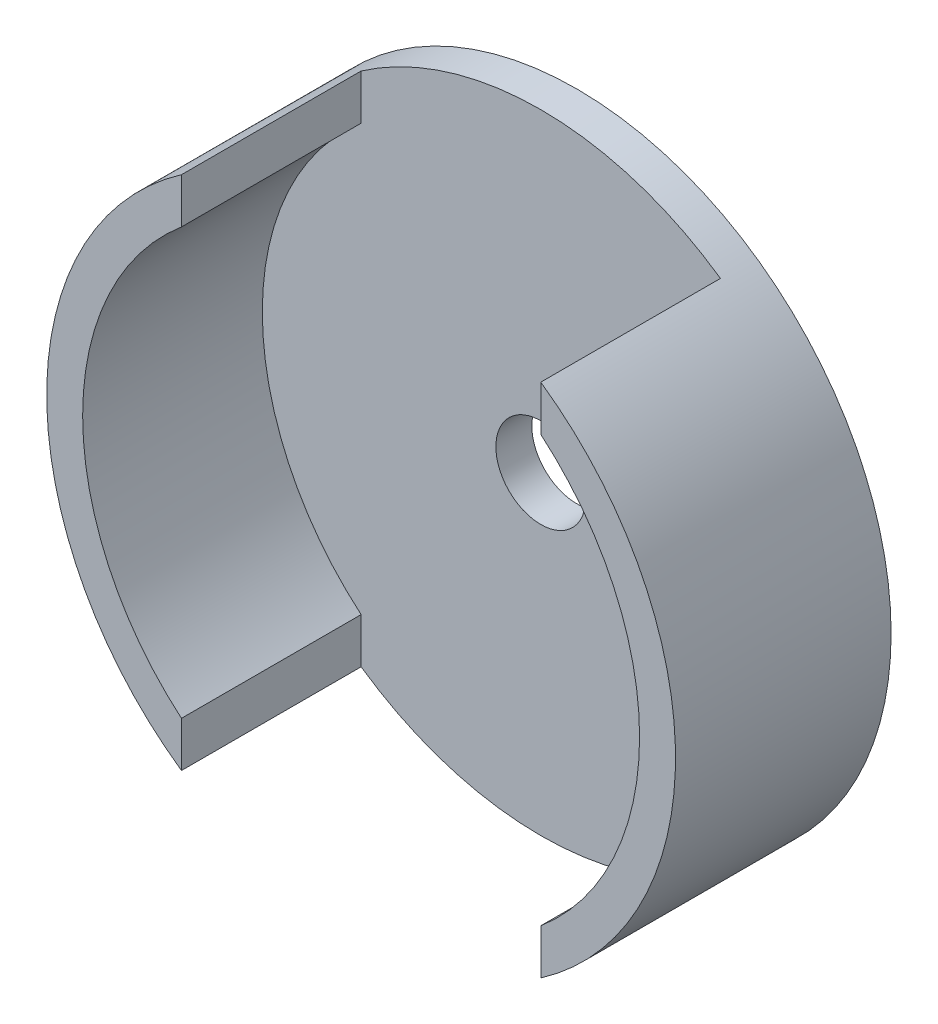
ISO-10303-21;
HEADER;
FILE_DESCRIPTION(('STEP AP214'),'2;1');
FILE_NAME('part.step','',(''),(''),'','','');
FILE_SCHEMA(('AUTOMOTIVE_DESIGN { 1 0 10303 214 1 1 1 1 }'));
ENDSEC;
DATA;
#1=APPLICATION_CONTEXT('core data for automotive mechanical design processes');
#2=APPLICATION_PROTOCOL_DEFINITION('international standard','automotive_design',2000,#1);
#3=PRODUCT_CONTEXT('',#1,'mechanical');
#4=PRODUCT('Part','Part','',(#3));
#5=PRODUCT_RELATED_PRODUCT_CATEGORY('part','',(#4));
#6=PRODUCT_DEFINITION_FORMATION('','',#4);
#7=PRODUCT_DEFINITION_CONTEXT('part definition',#1,'design');
#8=PRODUCT_DEFINITION('design','',#6,#7);
#9=PRODUCT_DEFINITION_SHAPE('','',#8);
#10=(LENGTH_UNIT() NAMED_UNIT(*) SI_UNIT(.MILLI.,.METRE.));
#11=(NAMED_UNIT(*) PLANE_ANGLE_UNIT() SI_UNIT($,.RADIAN.));
#12=(NAMED_UNIT(*) SI_UNIT($,.STERADIAN.) SOLID_ANGLE_UNIT());
#13=UNCERTAINTY_MEASURE_WITH_UNIT(LENGTH_MEASURE(1.E-05),#10,'distance_accuracy_value','');
#14=(GEOMETRIC_REPRESENTATION_CONTEXT(3) GLOBAL_UNCERTAINTY_ASSIGNED_CONTEXT((#13)) GLOBAL_UNIT_ASSIGNED_CONTEXT((#10,
#11,#12)) REPRESENTATION_CONTEXT('',''));
#15=CARTESIAN_POINT('',(0.,0.,0.));
#16=DIRECTION('',(0.,0.,1.));
#17=DIRECTION('',(1.,0.,0.));
#18=AXIS2_PLACEMENT_3D('',#15,#16,#17);
#19=CARTESIAN_POINT('',(0.,0.,12.));
#20=DIRECTION('',(0.,0.,1.));
#21=DIRECTION('',(1.,0.,0.));
#22=AXIS2_PLACEMENT_3D('',#19,#20,#21);
#23=PLANE('',#22);
#24=DIRECTION('',(0.,-1.,0.));
#25=VECTOR('',#24,1.);
#26=CARTESIAN_POINT('',(-10.,0.,12.));
#27=LINE('',#26,#25);
#28=CARTESIAN_POINT('',(-10.,14.3614066163451,12.));
#29=VERTEX_POINT('',#28);
#30=CARTESIAN_POINT('',(-10.,11.842719282327,12.));
#31=VERTEX_POINT('',#30);
#32=EDGE_CURVE('E159',#29,#31,#27,.T.);
#33=ORIENTED_EDGE('',*,*,#32,.F.);
#34=CARTESIAN_POINT('',(0.,0.,12.));
#35=DIRECTION('',(0.,0.,1.));
#36=DIRECTION('',(1.,0.,0.));
#37=AXIS2_PLACEMENT_3D('',#34,#35,#36);
#38=CIRCLE('',#37,17.5);
#39=CARTESIAN_POINT('',(-10.,-14.3614066163451,12.));
#40=VERTEX_POINT('',#39);
#41=EDGE_CURVE('E11',#29,#40,#38,.T.);
#42=ORIENTED_EDGE('',*,*,#41,.T.);
#43=CARTESIAN_POINT('',(-10.,-11.842719282327,12.));
#44=VERTEX_POINT('',#43);
#45=EDGE_CURVE('E131',#44,#40,#27,.T.);
#46=ORIENTED_EDGE('',*,*,#45,.F.);
#47=CARTESIAN_POINT('',(0.,0.,12.));
#48=DIRECTION('',(0.,0.,1.));
#49=DIRECTION('',(1.,0.,0.));
#50=AXIS2_PLACEMENT_3D('',#47,#48,#49);
#51=CIRCLE('',#50,15.5);
#52=EDGE_CURVE('E172',#31,#44,#51,.T.);
#53=ORIENTED_EDGE('',*,*,#52,.F.);
#54=EDGE_LOOP('',(#33,#42,#46,#53));
#55=FACE_BOUND('',#54,.T.);
#56=ADVANCED_FACE('F45',(#55),#23,.T.);
#57=CARTESIAN_POINT('',(0.,0.,12.));
#58=DIRECTION('',(0.,0.,-1.));
#59=DIRECTION('',(-1.,0.,0.));
#60=AXIS2_PLACEMENT_3D('',#57,#58,#59);
#61=CYLINDRICAL_SURFACE('',#60,15.5);
#62=DIRECTION('',(0.,0.,-1.));
#63=VECTOR('',#62,1.);
#64=CARTESIAN_POINT('',(-10.,11.842719282327,12.));
#65=LINE('',#64,#63);
#66=CARTESIAN_POINT('',(-10.,11.842719282327,2.));
#67=VERTEX_POINT('',#66);
#68=EDGE_CURVE('E132',#31,#67,#65,.T.);
#69=ORIENTED_EDGE('',*,*,#68,.F.);
#70=ORIENTED_EDGE('',*,*,#52,.T.);
#71=DIRECTION('',(0.,0.,-1.));
#72=VECTOR('',#71,1.);
#73=CARTESIAN_POINT('',(-10.,-11.842719282327,12.));
#74=LINE('',#73,#72);
#75=CARTESIAN_POINT('',(-10.,-11.842719282327,2.));
#76=VERTEX_POINT('',#75);
#77=EDGE_CURVE('E157',#76,#44,#74,.F.);
#78=ORIENTED_EDGE('',*,*,#77,.F.);
#79=CARTESIAN_POINT('',(0.,0.,2.));
#80=DIRECTION('',(0.,0.,1.));
#81=DIRECTION('',(1.,0.,0.));
#82=AXIS2_PLACEMENT_3D('',#79,#80,#81);
#83=CIRCLE('',#82,15.5);
#84=EDGE_CURVE('E140',#67,#76,#83,.T.);
#85=ORIENTED_EDGE('',*,*,#84,.F.);
#86=EDGE_LOOP('',(#69,#70,#78,#85));
#87=FACE_BOUND('',#86,.T.);
#88=ADVANCED_FACE('F181',(#87),#61,.F.);
#89=CARTESIAN_POINT('',(0.,0.,12.));
#90=DIRECTION('',(0.,0.,-1.));
#91=DIRECTION('',(-1.,0.,0.));
#92=AXIS2_PLACEMENT_3D('',#89,#90,#91);
#93=CYLINDRICAL_SURFACE('',#92,17.5);
#94=ORIENTED_EDGE('',*,*,#41,.F.);
#95=DIRECTION('',(0.,0.,-1.));
#96=VECTOR('',#95,1.);
#97=CARTESIAN_POINT('',(-10.,14.3614066163451,12.));
#98=LINE('',#97,#96);
#99=CARTESIAN_POINT('',(-10.,14.3614066163451,2.));
#100=VERTEX_POINT('',#99);
#101=EDGE_CURVE('E162',#29,#100,#98,.T.);
#102=ORIENTED_EDGE('',*,*,#101,.T.);
#103=CARTESIAN_POINT('',(0.,0.,2.));
#104=DIRECTION('',(0.,0.,-1.));
#105=DIRECTION('',(-1.,0.,0.));
#106=AXIS2_PLACEMENT_3D('',#103,#104,#105);
#107=CIRCLE('',#106,17.5);
#108=CARTESIAN_POINT('',(10.,14.3614066163451,2.));
#109=VERTEX_POINT('',#108);
#110=EDGE_CURVE('E124',#100,#109,#107,.T.);
#111=ORIENTED_EDGE('',*,*,#110,.T.);
#112=DIRECTION('',(0.,0.,-1.));
#113=VECTOR('',#112,1.);
#114=CARTESIAN_POINT('',(10.,14.3614066163451,12.));
#115=LINE('',#114,#113);
#116=CARTESIAN_POINT('',(10.,14.3614066163451,12.));
#117=VERTEX_POINT('',#116);
#118=EDGE_CURVE('E151',#109,#117,#115,.F.);
#119=ORIENTED_EDGE('',*,*,#118,.T.);
#120=CARTESIAN_POINT('',(10.,-14.3614066163451,12.));
#121=VERTEX_POINT('',#120);
#122=EDGE_CURVE('E54',#121,#117,#38,.T.);
#123=ORIENTED_EDGE('',*,*,#122,.F.);
#124=DIRECTION('',(0.,0.,-1.));
#125=VECTOR('',#124,1.);
#126=CARTESIAN_POINT('',(10.,-14.3614066163451,12.));
#127=LINE('',#126,#125);
#128=CARTESIAN_POINT('',(10.,-14.3614066163451,2.));
#129=VERTEX_POINT('',#128);
#130=EDGE_CURVE('E119',#121,#129,#127,.T.);
#131=ORIENTED_EDGE('',*,*,#130,.T.);
#132=CARTESIAN_POINT('',(-10.,-14.3614066163451,2.));
#133=VERTEX_POINT('',#132);
#134=EDGE_CURVE('E113',#129,#133,#107,.T.);
#135=ORIENTED_EDGE('',*,*,#134,.T.);
#136=DIRECTION('',(0.,0.,-1.));
#137=VECTOR('',#136,1.);
#138=CARTESIAN_POINT('',(-10.,-14.3614066163451,12.));
#139=LINE('',#138,#137);
#140=EDGE_CURVE('E117',#133,#40,#139,.F.);
#141=ORIENTED_EDGE('',*,*,#140,.T.);
#142=EDGE_LOOP('',(#94,#102,#111,#119,#123,#131,#135,#141));
#143=FACE_BOUND('',#142,.T.);
#144=CARTESIAN_POINT('',(0.,0.,0.));
#145=DIRECTION('',(0.,0.,1.));
#146=DIRECTION('',(1.,0.,0.));
#147=AXIS2_PLACEMENT_3D('',#144,#145,#146);
#148=CIRCLE('',#147,17.5);
#149=CARTESIAN_POINT('',(17.5,0.,0.));
#150=VERTEX_POINT('',#149);
#151=EDGE_CURVE('E174',#150,#150,#148,.T.);
#152=ORIENTED_EDGE('',*,*,#151,.T.);
#153=EDGE_LOOP('',(#152));
#154=FACE_BOUND('',#153,.T.);
#155=ADVANCED_FACE('F47',(#143,#154),#93,.T.);
#156=DIRECTION('',(0.,1.,0.));
#157=VECTOR('',#156,1.);
#158=CARTESIAN_POINT('',(10.,0.,12.));
#159=LINE('',#158,#157);
#160=CARTESIAN_POINT('',(10.,-11.842719282327,12.));
#161=VERTEX_POINT('',#160);
#162=EDGE_CURVE('E62',#121,#161,#159,.T.);
#163=ORIENTED_EDGE('',*,*,#162,.F.);
#164=ORIENTED_EDGE('',*,*,#122,.T.);
#165=CARTESIAN_POINT('',(10.,11.842719282327,12.));
#166=VERTEX_POINT('',#165);
#167=EDGE_CURVE('E149',#166,#117,#159,.T.);
#168=ORIENTED_EDGE('',*,*,#167,.F.);
#169=EDGE_CURVE('E170',#161,#166,#51,.T.);
#170=ORIENTED_EDGE('',*,*,#169,.F.);
#171=EDGE_LOOP('',(#163,#164,#168,#170));
#172=FACE_BOUND('',#171,.T.);
#173=ADVANCED_FACE('F193',(#172),#23,.T.);
#174=CARTESIAN_POINT('',(0.,0.,0.));
#175=DIRECTION('',(0.,0.,1.));
#176=DIRECTION('',(1.,0.,0.));
#177=AXIS2_PLACEMENT_3D('',#174,#175,#176);
#178=PLANE('',#177);
#179=CARTESIAN_POINT('',(0.,0.,0.));
#180=DIRECTION('',(0.,0.,1.));
#181=DIRECTION('',(1.,0.,0.));
#182=AXIS2_PLACEMENT_3D('',#179,#180,#181);
#183=CIRCLE('',#182,2.5);
#184=CARTESIAN_POINT('',(2.5,0.,0.));
#185=VERTEX_POINT('',#184);
#186=EDGE_CURVE('E165',#185,#185,#183,.F.);
#187=ORIENTED_EDGE('',*,*,#186,.F.);
#188=EDGE_LOOP('',(#187));
#189=FACE_BOUND('',#188,.T.);
#190=ORIENTED_EDGE('',*,*,#151,.F.);
#191=EDGE_LOOP('',(#190));
#192=FACE_BOUND('',#191,.T.);
#193=ADVANCED_FACE('F195',(#189,#192),#178,.F.);
#194=DIRECTION('',(0.,0.,-1.));
#195=VECTOR('',#194,1.);
#196=CARTESIAN_POINT('',(10.,-11.842719282327,12.));
#197=LINE('',#196,#195);
#198=CARTESIAN_POINT('',(10.,-11.842719282327,2.));
#199=VERTEX_POINT('',#198);
#200=EDGE_CURVE('E154',#161,#199,#197,.T.);
#201=ORIENTED_EDGE('',*,*,#200,.F.);
#202=ORIENTED_EDGE('',*,*,#169,.T.);
#203=DIRECTION('',(0.,0.,-1.));
#204=VECTOR('',#203,1.);
#205=CARTESIAN_POINT('',(10.,11.842719282327,12.));
#206=LINE('',#205,#204);
#207=CARTESIAN_POINT('',(10.,11.842719282327,2.));
#208=VERTEX_POINT('',#207);
#209=EDGE_CURVE('E147',#208,#166,#206,.F.);
#210=ORIENTED_EDGE('',*,*,#209,.F.);
#211=EDGE_CURVE('E168',#199,#208,#83,.T.);
#212=ORIENTED_EDGE('',*,*,#211,.F.);
#213=EDGE_LOOP('',(#201,#202,#210,#212));
#214=FACE_BOUND('',#213,.T.);
#215=ADVANCED_FACE('F188',(#214),#61,.F.);
#216=CARTESIAN_POINT('',(0.,0.,2.));
#217=DIRECTION('',(0.,0.,1.));
#218=DIRECTION('',(1.,0.,0.));
#219=AXIS2_PLACEMENT_3D('',#216,#217,#218);
#220=PLANE('',#219);
#221=ORIENTED_EDGE('',*,*,#211,.T.);
#222=DIRECTION('',(0.,1.,0.));
#223=VECTOR('',#222,1.);
#224=CARTESIAN_POINT('',(10.,-17.5,2.));
#225=LINE('',#224,#223);
#226=EDGE_CURVE('E70',#208,#109,#225,.T.);
#227=ORIENTED_EDGE('',*,*,#226,.T.);
#228=ORIENTED_EDGE('',*,*,#110,.F.);
#229=DIRECTION('',(0.,1.,0.));
#230=VECTOR('',#229,1.);
#231=CARTESIAN_POINT('',(-10.,-17.5,2.));
#232=LINE('',#231,#230);
#233=EDGE_CURVE('E141',#67,#100,#232,.T.);
#234=ORIENTED_EDGE('',*,*,#233,.F.);
#235=ORIENTED_EDGE('',*,*,#84,.T.);
#236=EDGE_CURVE('E125',#133,#76,#232,.T.);
#237=ORIENTED_EDGE('',*,*,#236,.F.);
#238=ORIENTED_EDGE('',*,*,#134,.F.);
#239=EDGE_CURVE('E144',#129,#199,#225,.T.);
#240=ORIENTED_EDGE('',*,*,#239,.T.);
#241=EDGE_LOOP('',(#221,#227,#228,#234,#235,#237,#238,#240));
#242=FACE_BOUND('',#241,.T.);
#243=CARTESIAN_POINT('',(0.,0.,2.));
#244=DIRECTION('',(0.,0.,1.));
#245=DIRECTION('',(1.,0.,0.));
#246=AXIS2_PLACEMENT_3D('',#243,#244,#245);
#247=CIRCLE('',#246,2.5);
#248=CARTESIAN_POINT('',(2.5,0.,2.));
#249=VERTEX_POINT('',#248);
#250=EDGE_CURVE('E49',#249,#249,#247,.F.);
#251=ORIENTED_EDGE('',*,*,#250,.T.);
#252=EDGE_LOOP('',(#251));
#253=FACE_BOUND('',#252,.T.);
#254=ADVANCED_FACE('F136',(#242,#253),#220,.T.);
#255=CARTESIAN_POINT('',(0.,0.,12.));
#256=DIRECTION('',(0.,0.,-1.));
#257=DIRECTION('',(-1.,0.,0.));
#258=AXIS2_PLACEMENT_3D('',#255,#256,#257);
#259=CYLINDRICAL_SURFACE('',#258,2.5);
#260=ORIENTED_EDGE('',*,*,#250,.F.);
#261=EDGE_LOOP('',(#260));
#262=FACE_BOUND('',#261,.T.);
#263=ORIENTED_EDGE('',*,*,#186,.T.);
#264=EDGE_LOOP('',(#263));
#265=FACE_BOUND('',#264,.T.);
#266=ADVANCED_FACE('F216',(#262,#265),#259,.F.);
#267=CARTESIAN_POINT('',(10.,-17.5,2.));
#268=DIRECTION('',(1.,0.,0.));
#269=DIRECTION('',(0.,0.,-1.));
#270=AXIS2_PLACEMENT_3D('',#267,#268,#269);
#271=PLANE('',#270);
#272=ORIENTED_EDGE('',*,*,#226,.F.);
#273=ORIENTED_EDGE('',*,*,#209,.T.);
#274=ORIENTED_EDGE('',*,*,#167,.T.);
#275=ORIENTED_EDGE('',*,*,#118,.F.);
#276=EDGE_LOOP('',(#272,#273,#274,#275));
#277=FACE_BOUND('',#276,.T.);
#278=ADVANCED_FACE('F191',(#277),#271,.F.);
#279=CARTESIAN_POINT('',(-10.,-17.5,2.));
#280=DIRECTION('',(-1.,0.,0.));
#281=DIRECTION('',(0.,0.,1.));
#282=AXIS2_PLACEMENT_3D('',#279,#280,#281);
#283=PLANE('',#282);
#284=ORIENTED_EDGE('',*,*,#32,.T.);
#285=ORIENTED_EDGE('',*,*,#68,.T.);
#286=ORIENTED_EDGE('',*,*,#233,.T.);
#287=ORIENTED_EDGE('',*,*,#101,.F.);
#288=EDGE_LOOP('',(#284,#285,#286,#287));
#289=FACE_BOUND('',#288,.T.);
#290=ADVANCED_FACE('F185',(#289),#283,.F.);
#291=ORIENTED_EDGE('',*,*,#236,.T.);
#292=ORIENTED_EDGE('',*,*,#77,.T.);
#293=ORIENTED_EDGE('',*,*,#45,.T.);
#294=ORIENTED_EDGE('',*,*,#140,.F.);
#295=EDGE_LOOP('',(#291,#292,#293,#294));
#296=FACE_BOUND('',#295,.T.);
#297=ADVANCED_FACE('F128',(#296),#283,.F.);
#298=ORIENTED_EDGE('',*,*,#162,.T.);
#299=ORIENTED_EDGE('',*,*,#200,.T.);
#300=ORIENTED_EDGE('',*,*,#239,.F.);
#301=ORIENTED_EDGE('',*,*,#130,.F.);
#302=EDGE_LOOP('',(#298,#299,#300,#301));
#303=FACE_BOUND('',#302,.T.);
#304=ADVANCED_FACE('F224',(#303),#271,.F.);
#305=CLOSED_SHELL('',(#56,#88,#155,#173,#193,#215,#254,#266,#278,#290,#297,#304));
#306=MANIFOLD_SOLID_BREP('B2',#305);
#307=ADVANCED_BREP_SHAPE_REPRESENTATION('',(#18,#306),#14);
#308=SHAPE_DEFINITION_REPRESENTATION(#9,#307);
ENDSEC;
END-ISO-10303-21;
